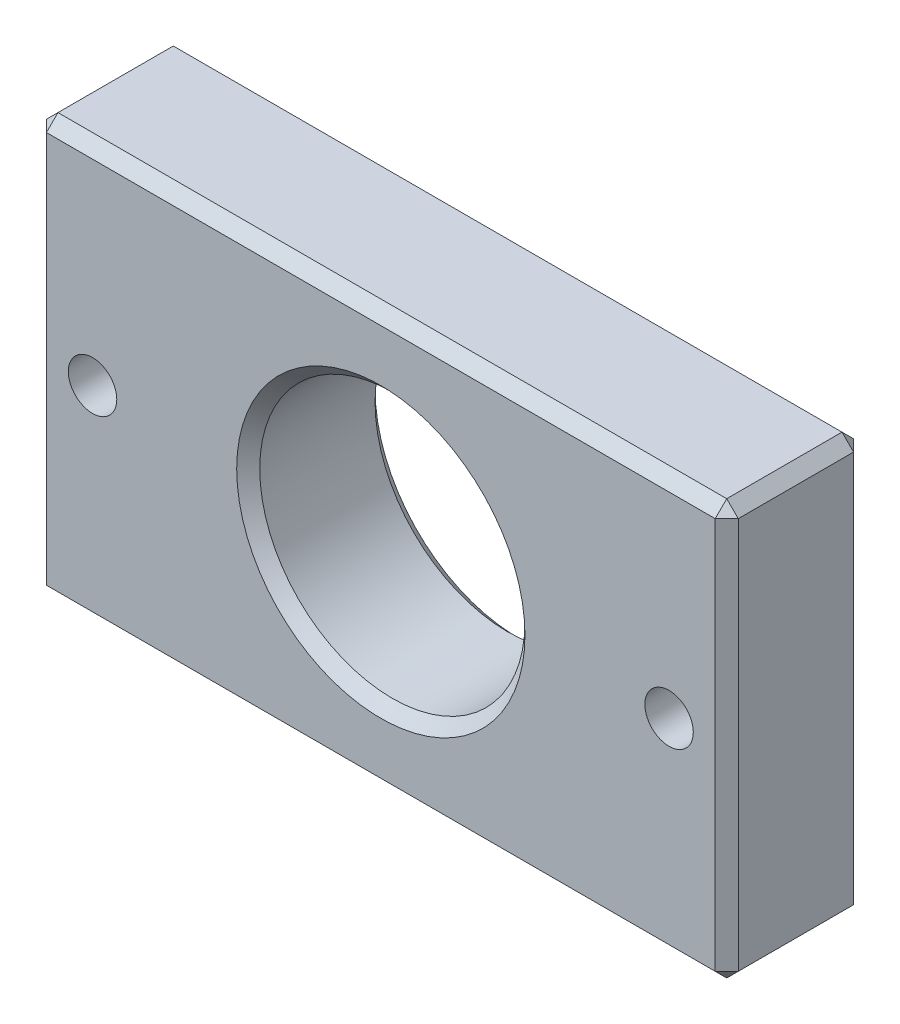
ISO-10303-21;
HEADER;
FILE_DESCRIPTION(('STEP AP214'),'2;1');
FILE_NAME('part.step','',(''),(''),'','','');
FILE_SCHEMA(('AUTOMOTIVE_DESIGN { 1 0 10303 214 1 1 1 1 }'));
ENDSEC;
DATA;
#1=APPLICATION_CONTEXT('core data for automotive mechanical design processes');
#2=APPLICATION_PROTOCOL_DEFINITION('international standard','automotive_design',2000,#1);
#3=PRODUCT_CONTEXT('',#1,'mechanical');
#4=PRODUCT('Part','Part','',(#3));
#5=PRODUCT_RELATED_PRODUCT_CATEGORY('part','',(#4));
#6=PRODUCT_DEFINITION_FORMATION('','',#4);
#7=PRODUCT_DEFINITION_CONTEXT('part definition',#1,'design');
#8=PRODUCT_DEFINITION('design','',#6,#7);
#9=PRODUCT_DEFINITION_SHAPE('','',#8);
#10=(LENGTH_UNIT() NAMED_UNIT(*) SI_UNIT(.MILLI.,.METRE.));
#11=(NAMED_UNIT(*) PLANE_ANGLE_UNIT() SI_UNIT($,.RADIAN.));
#12=(NAMED_UNIT(*) SI_UNIT($,.STERADIAN.) SOLID_ANGLE_UNIT());
#13=UNCERTAINTY_MEASURE_WITH_UNIT(LENGTH_MEASURE(1.E-05),#10,'distance_accuracy_value','');
#14=(GEOMETRIC_REPRESENTATION_CONTEXT(3) GLOBAL_UNCERTAINTY_ASSIGNED_CONTEXT((#13)) GLOBAL_UNIT_ASSIGNED_CONTEXT((#10,
#11,#12)) REPRESENTATION_CONTEXT('',''));
#15=CARTESIAN_POINT('',(0.,0.,0.));
#16=DIRECTION('',(0.,0.,1.));
#17=DIRECTION('',(1.,0.,0.));
#18=AXIS2_PLACEMENT_3D('',#15,#16,#17);
#19=CARTESIAN_POINT('',(-30.,18.,12.));
#20=DIRECTION('',(1.,0.,0.));
#21=DIRECTION('',(0.,1.,0.));
#22=AXIS2_PLACEMENT_3D('',#19,#20,#21);
#23=PLANE('',#22);
#24=DIRECTION('',(0.,-1.,0.));
#25=VECTOR('',#24,1.);
#26=CARTESIAN_POINT('',(-30.,18.,1.));
#27=LINE('',#26,#25);
#28=CARTESIAN_POINT('',(-30.,17.,1.));
#29=VERTEX_POINT('',#28);
#30=CARTESIAN_POINT('',(-30.,-17.,1.));
#31=VERTEX_POINT('',#30);
#32=EDGE_CURVE('E173',#29,#31,#27,.T.);
#33=ORIENTED_EDGE('',*,*,#32,.T.);
#34=DIRECTION('',(0.,0.,1.));
#35=VECTOR('',#34,1.);
#36=CARTESIAN_POINT('',(-30.,-17.,12.));
#37=LINE('',#36,#35);
#38=CARTESIAN_POINT('',(-30.,-17.,11.));
#39=VERTEX_POINT('',#38);
#40=EDGE_CURVE('E178',#31,#39,#37,.T.);
#41=ORIENTED_EDGE('',*,*,#40,.T.);
#42=DIRECTION('',(0.,1.,0.));
#43=VECTOR('',#42,1.);
#44=CARTESIAN_POINT('',(-30.,18.,11.));
#45=LINE('',#44,#43);
#46=CARTESIAN_POINT('',(-30.,17.,11.));
#47=VERTEX_POINT('',#46);
#48=EDGE_CURVE('E175',#39,#47,#45,.T.);
#49=ORIENTED_EDGE('',*,*,#48,.T.);
#50=DIRECTION('',(0.,0.,-1.));
#51=VECTOR('',#50,1.);
#52=CARTESIAN_POINT('',(-30.,17.,12.));
#53=LINE('',#52,#51);
#54=EDGE_CURVE('E171',#47,#29,#53,.T.);
#55=ORIENTED_EDGE('',*,*,#54,.T.);
#56=EDGE_LOOP('',(#33,#41,#49,#55));
#57=FACE_BOUND('',#56,.T.);
#58=ADVANCED_FACE('F35',(#57),#23,.F.);
#59=CARTESIAN_POINT('',(-30.,-18.,12.));
#60=DIRECTION('',(0.,1.,0.));
#61=DIRECTION('',(-1.,0.,0.));
#62=AXIS2_PLACEMENT_3D('',#59,#60,#61);
#63=PLANE('',#62);
#64=DIRECTION('',(-1.,0.,0.));
#65=VECTOR('',#64,1.);
#66=CARTESIAN_POINT('',(-30.,-18.,11.));
#67=LINE('',#66,#65);
#68=CARTESIAN_POINT('',(29.,-18.,11.));
#69=VERTEX_POINT('',#68);
#70=CARTESIAN_POINT('',(-29.,-18.,11.));
#71=VERTEX_POINT('',#70);
#72=EDGE_CURVE('E196',#69,#71,#67,.T.);
#73=ORIENTED_EDGE('',*,*,#72,.T.);
#74=DIRECTION('',(0.,0.,-1.));
#75=VECTOR('',#74,1.);
#76=CARTESIAN_POINT('',(-29.,-18.,12.));
#77=LINE('',#76,#75);
#78=CARTESIAN_POINT('',(-29.,-18.,1.));
#79=VERTEX_POINT('',#78);
#80=EDGE_CURVE('E198',#71,#79,#77,.T.);
#81=ORIENTED_EDGE('',*,*,#80,.T.);
#82=DIRECTION('',(1.,0.,0.));
#83=VECTOR('',#82,1.);
#84=CARTESIAN_POINT('',(-30.,-18.,1.));
#85=LINE('',#84,#83);
#86=CARTESIAN_POINT('',(29.,-18.,1.));
#87=VERTEX_POINT('',#86);
#88=EDGE_CURVE('E194',#79,#87,#85,.T.);
#89=ORIENTED_EDGE('',*,*,#88,.T.);
#90=DIRECTION('',(0.,0.,1.));
#91=VECTOR('',#90,1.);
#92=CARTESIAN_POINT('',(29.,-18.,12.));
#93=LINE('',#92,#91);
#94=EDGE_CURVE('E192',#87,#69,#93,.T.);
#95=ORIENTED_EDGE('',*,*,#94,.T.);
#96=EDGE_LOOP('',(#73,#81,#89,#95));
#97=FACE_BOUND('',#96,.T.);
#98=ADVANCED_FACE('F312',(#97),#63,.F.);
#99=CARTESIAN_POINT('',(30.,18.,12.));
#100=DIRECTION('',(-1.,0.,0.));
#101=DIRECTION('',(0.,-1.,0.));
#102=AXIS2_PLACEMENT_3D('',#99,#100,#101);
#103=PLANE('',#102);
#104=DIRECTION('',(0.,-1.,0.));
#105=VECTOR('',#104,1.);
#106=CARTESIAN_POINT('',(30.,-18.,11.));
#107=LINE('',#106,#105);
#108=CARTESIAN_POINT('',(30.,17.,11.));
#109=VERTEX_POINT('',#108);
#110=CARTESIAN_POINT('',(30.,-17.,11.));
#111=VERTEX_POINT('',#110);
#112=EDGE_CURVE('E143',#109,#111,#107,.T.);
#113=ORIENTED_EDGE('',*,*,#112,.T.);
#114=DIRECTION('',(0.,0.,-1.));
#115=VECTOR('',#114,1.);
#116=CARTESIAN_POINT('',(30.,-17.,12.));
#117=LINE('',#116,#115);
#118=CARTESIAN_POINT('',(30.,-17.,1.));
#119=VERTEX_POINT('',#118);
#120=EDGE_CURVE('E206',#111,#119,#117,.T.);
#121=ORIENTED_EDGE('',*,*,#120,.T.);
#122=DIRECTION('',(0.,1.,0.));
#123=VECTOR('',#122,1.);
#124=CARTESIAN_POINT('',(30.,18.,1.));
#125=LINE('',#124,#123);
#126=CARTESIAN_POINT('',(30.,17.,1.));
#127=VERTEX_POINT('',#126);
#128=EDGE_CURVE('E203',#119,#127,#125,.T.);
#129=ORIENTED_EDGE('',*,*,#128,.T.);
#130=DIRECTION('',(0.,0.,1.));
#131=VECTOR('',#130,1.);
#132=CARTESIAN_POINT('',(30.,17.,12.));
#133=LINE('',#132,#131);
#134=EDGE_CURVE('E201',#127,#109,#133,.T.);
#135=ORIENTED_EDGE('',*,*,#134,.T.);
#136=EDGE_LOOP('',(#113,#121,#129,#135));
#137=FACE_BOUND('',#136,.T.);
#138=ADVANCED_FACE('F308',(#137),#103,.F.);
#139=CARTESIAN_POINT('',(-30.,18.,12.));
#140=DIRECTION('',(0.,-1.,0.));
#141=DIRECTION('',(1.,0.,0.));
#142=AXIS2_PLACEMENT_3D('',#139,#140,#141);
#143=PLANE('',#142);
#144=DIRECTION('',(1.,0.,0.));
#145=VECTOR('',#144,1.);
#146=CARTESIAN_POINT('',(30.,18.,11.));
#147=LINE('',#146,#145);
#148=CARTESIAN_POINT('',(-29.,18.,11.));
#149=VERTEX_POINT('',#148);
#150=CARTESIAN_POINT('',(29.,18.,11.));
#151=VERTEX_POINT('',#150);
#152=EDGE_CURVE('E52',#149,#151,#147,.T.);
#153=ORIENTED_EDGE('',*,*,#152,.T.);
#154=DIRECTION('',(0.,0.,-1.));
#155=VECTOR('',#154,1.);
#156=CARTESIAN_POINT('',(29.,18.,12.));
#157=LINE('',#156,#155);
#158=CARTESIAN_POINT('',(29.,18.,1.));
#159=VERTEX_POINT('',#158);
#160=EDGE_CURVE('E213',#151,#159,#157,.T.);
#161=ORIENTED_EDGE('',*,*,#160,.T.);
#162=DIRECTION('',(-1.,0.,0.));
#163=VECTOR('',#162,1.);
#164=CARTESIAN_POINT('',(-30.,18.,1.));
#165=LINE('',#164,#163);
#166=CARTESIAN_POINT('',(-29.,18.,1.));
#167=VERTEX_POINT('',#166);
#168=EDGE_CURVE('E209',#159,#167,#165,.T.);
#169=ORIENTED_EDGE('',*,*,#168,.T.);
#170=DIRECTION('',(0.,0.,1.));
#171=VECTOR('',#170,1.);
#172=CARTESIAN_POINT('',(-29.,18.,12.));
#173=LINE('',#172,#171);
#174=EDGE_CURVE('E57',#167,#149,#173,.T.);
#175=ORIENTED_EDGE('',*,*,#174,.T.);
#176=EDGE_LOOP('',(#153,#161,#169,#175));
#177=FACE_BOUND('',#176,.T.);
#178=ADVANCED_FACE('F300',(#177),#143,.F.);
#179=CARTESIAN_POINT('',(0.,0.,12.));
#180=DIRECTION('',(0.,0.,1.));
#181=DIRECTION('',(1.,0.,0.));
#182=AXIS2_PLACEMENT_3D('',#179,#180,#181);
#183=PLANE('',#182);
#184=DIRECTION('',(-1.,0.,0.));
#185=VECTOR('',#184,1.);
#186=CARTESIAN_POINT('',(-30.,17.,12.));
#187=LINE('',#186,#185);
#188=CARTESIAN_POINT('',(29.,17.,12.));
#189=VERTEX_POINT('',#188);
#190=CARTESIAN_POINT('',(-29.,17.,12.));
#191=VERTEX_POINT('',#190);
#192=EDGE_CURVE('E130',#189,#191,#187,.T.);
#193=ORIENTED_EDGE('',*,*,#192,.T.);
#194=DIRECTION('',(0.,-1.,0.));
#195=VECTOR('',#194,1.);
#196=CARTESIAN_POINT('',(-29.,-18.,12.));
#197=LINE('',#196,#195);
#198=CARTESIAN_POINT('',(-29.,-17.,12.));
#199=VERTEX_POINT('',#198);
#200=EDGE_CURVE('E169',#191,#199,#197,.T.);
#201=ORIENTED_EDGE('',*,*,#200,.T.);
#202=DIRECTION('',(1.,0.,0.));
#203=VECTOR('',#202,1.);
#204=CARTESIAN_POINT('',(30.,-17.,12.));
#205=LINE('',#204,#203);
#206=CARTESIAN_POINT('',(29.,-17.,12.));
#207=VERTEX_POINT('',#206);
#208=EDGE_CURVE('E133',#199,#207,#205,.T.);
#209=ORIENTED_EDGE('',*,*,#208,.T.);
#210=DIRECTION('',(0.,1.,0.));
#211=VECTOR('',#210,1.);
#212=CARTESIAN_POINT('',(29.,18.,12.));
#213=LINE('',#212,#211);
#214=EDGE_CURVE('E124',#207,#189,#213,.T.);
#215=ORIENTED_EDGE('',*,*,#214,.T.);
#216=EDGE_LOOP('',(#193,#201,#209,#215));
#217=FACE_BOUND('',#216,.T.);
#218=CARTESIAN_POINT('',(0.,0.,12.));
#219=DIRECTION('',(0.,0.,1.));
#220=DIRECTION('',(1.,0.,0.));
#221=AXIS2_PLACEMENT_3D('',#218,#219,#220);
#222=CIRCLE('',#221,12.5);
#223=CARTESIAN_POINT('',(12.5,0.,12.));
#224=VERTEX_POINT('',#223);
#225=EDGE_CURVE('E161',#224,#224,#222,.F.);
#226=ORIENTED_EDGE('',*,*,#225,.T.);
#227=EDGE_LOOP('',(#226));
#228=FACE_BOUND('',#227,.T.);
#229=CARTESIAN_POINT('',(-25.,0.,12.));
#230=DIRECTION('',(0.,0.,1.));
#231=DIRECTION('',(1.,0.,0.));
#232=AXIS2_PLACEMENT_3D('',#229,#230,#231);
#233=CIRCLE('',#232,2.09999999999999);
#234=CARTESIAN_POINT('',(-22.9,0.,12.));
#235=VERTEX_POINT('',#234);
#236=EDGE_CURVE('E271',#235,#235,#233,.T.);
#237=ORIENTED_EDGE('',*,*,#236,.F.);
#238=EDGE_LOOP('',(#237));
#239=FACE_BOUND('',#238,.T.);
#240=CARTESIAN_POINT('',(25.,0.,12.));
#241=DIRECTION('',(0.,0.,1.));
#242=DIRECTION('',(1.,0.,0.));
#243=AXIS2_PLACEMENT_3D('',#240,#241,#242);
#244=CIRCLE('',#243,2.09999999999999);
#245=CARTESIAN_POINT('',(27.1,0.,12.));
#246=VERTEX_POINT('',#245);
#247=EDGE_CURVE('E282',#246,#246,#244,.T.);
#248=ORIENTED_EDGE('',*,*,#247,.F.);
#249=EDGE_LOOP('',(#248));
#250=FACE_BOUND('',#249,.T.);
#251=ADVANCED_FACE('F126',(#217,#228,#239,#250),#183,.T.);
#252=CARTESIAN_POINT('',(0.,0.,0.));
#253=DIRECTION('',(0.,0.,1.));
#254=DIRECTION('',(1.,0.,0.));
#255=AXIS2_PLACEMENT_3D('',#252,#253,#254);
#256=PLANE('',#255);
#257=DIRECTION('',(-1.,0.,0.));
#258=VECTOR('',#257,1.);
#259=CARTESIAN_POINT('',(0.,-17.,0.));
#260=LINE('',#259,#258);
#261=CARTESIAN_POINT('',(29.,-17.,0.));
#262=VERTEX_POINT('',#261);
#263=CARTESIAN_POINT('',(-29.,-17.,0.));
#264=VERTEX_POINT('',#263);
#265=EDGE_CURVE('E187',#262,#264,#260,.T.);
#266=ORIENTED_EDGE('',*,*,#265,.T.);
#267=DIRECTION('',(0.,1.,0.));
#268=VECTOR('',#267,1.);
#269=CARTESIAN_POINT('',(-29.,0.,0.));
#270=LINE('',#269,#268);
#271=CARTESIAN_POINT('',(-29.,17.,0.));
#272=VERTEX_POINT('',#271);
#273=EDGE_CURVE('E189',#264,#272,#270,.T.);
#274=ORIENTED_EDGE('',*,*,#273,.T.);
#275=DIRECTION('',(1.,0.,0.));
#276=VECTOR('',#275,1.);
#277=CARTESIAN_POINT('',(0.,17.,0.));
#278=LINE('',#277,#276);
#279=CARTESIAN_POINT('',(29.,17.,0.));
#280=VERTEX_POINT('',#279);
#281=EDGE_CURVE('E183',#272,#280,#278,.T.);
#282=ORIENTED_EDGE('',*,*,#281,.T.);
#283=DIRECTION('',(0.,-1.,0.));
#284=VECTOR('',#283,1.);
#285=CARTESIAN_POINT('',(29.,0.,0.));
#286=LINE('',#285,#284);
#287=EDGE_CURVE('E185',#280,#262,#286,.T.);
#288=ORIENTED_EDGE('',*,*,#287,.T.);
#289=EDGE_LOOP('',(#266,#274,#282,#288));
#290=FACE_BOUND('',#289,.T.);
#291=CARTESIAN_POINT('',(0.,0.,0.));
#292=DIRECTION('',(0.,0.,1.));
#293=DIRECTION('',(1.,0.,0.));
#294=AXIS2_PLACEMENT_3D('',#291,#292,#293);
#295=CIRCLE('',#294,12.5);
#296=CARTESIAN_POINT('',(12.5,0.,0.));
#297=VERTEX_POINT('',#296);
#298=EDGE_CURVE('E180',#297,#297,#295,.T.);
#299=ORIENTED_EDGE('',*,*,#298,.T.);
#300=EDGE_LOOP('',(#299));
#301=FACE_BOUND('',#300,.T.);
#302=CARTESIAN_POINT('',(-25.,0.,0.));
#303=DIRECTION('',(0.,0.,1.));
#304=DIRECTION('',(1.,0.,0.));
#305=AXIS2_PLACEMENT_3D('',#302,#303,#304);
#306=CIRCLE('',#305,2.09999999999999);
#307=CARTESIAN_POINT('',(-22.9,0.,0.));
#308=VERTEX_POINT('',#307);
#309=EDGE_CURVE('E277',#308,#308,#306,.T.);
#310=ORIENTED_EDGE('',*,*,#309,.T.);
#311=EDGE_LOOP('',(#310));
#312=FACE_BOUND('',#311,.T.);
#313=CARTESIAN_POINT('',(25.,0.,0.));
#314=DIRECTION('',(0.,0.,1.));
#315=DIRECTION('',(1.,0.,0.));
#316=AXIS2_PLACEMENT_3D('',#313,#314,#315);
#317=CIRCLE('',#316,2.09999999999999);
#318=CARTESIAN_POINT('',(27.1,0.,0.));
#319=VERTEX_POINT('',#318);
#320=EDGE_CURVE('E164',#319,#319,#317,.T.);
#321=ORIENTED_EDGE('',*,*,#320,.T.);
#322=EDGE_LOOP('',(#321));
#323=FACE_BOUND('',#322,.T.);
#324=ADVANCED_FACE('F289',(#290,#301,#312,#323),#256,.F.);
#325=CARTESIAN_POINT('',(0.,0.,-0.000999999999999265));
#326=DIRECTION('',(0.,0.,1.));
#327=DIRECTION('',(1.,0.,0.));
#328=AXIS2_PLACEMENT_3D('',#325,#326,#327);
#329=CYLINDRICAL_SURFACE('',#328,11.5);
#330=CARTESIAN_POINT('',(0.,0.,0.999999999999987));
#331=DIRECTION('',(0.,0.,1.));
#332=DIRECTION('',(1.,0.,0.));
#333=AXIS2_PLACEMENT_3D('',#330,#331,#332);
#334=CIRCLE('',#333,11.5);
#335=CARTESIAN_POINT('',(11.5,0.,0.999999999999987));
#336=VERTEX_POINT('',#335);
#337=EDGE_CURVE('E11',#336,#336,#334,.F.);
#338=ORIENTED_EDGE('',*,*,#337,.T.);
#339=EDGE_LOOP('',(#338));
#340=FACE_BOUND('',#339,.T.);
#341=CARTESIAN_POINT('',(0.,0.,11.));
#342=DIRECTION('',(0.,0.,1.));
#343=DIRECTION('',(1.,0.,0.));
#344=AXIS2_PLACEMENT_3D('',#341,#342,#343);
#345=CIRCLE('',#344,11.5);
#346=CARTESIAN_POINT('',(11.5,0.,11.));
#347=VERTEX_POINT('',#346);
#348=EDGE_CURVE('E44',#347,#347,#345,.T.);
#349=ORIENTED_EDGE('',*,*,#348,.T.);
#350=EDGE_LOOP('',(#349));
#351=FACE_BOUND('',#350,.T.);
#352=ADVANCED_FACE('F295',(#340,#351),#329,.F.);
#353=CARTESIAN_POINT('',(25.,0.,12.));
#354=DIRECTION('',(0.,0.,1.));
#355=DIRECTION('',(1.,0.,0.));
#356=AXIS2_PLACEMENT_3D('',#353,#354,#355);
#357=CYLINDRICAL_SURFACE('',#356,2.09999999999999);
#358=ORIENTED_EDGE('',*,*,#320,.F.);
#359=EDGE_LOOP('',(#358));
#360=FACE_BOUND('',#359,.T.);
#361=ORIENTED_EDGE('',*,*,#247,.T.);
#362=EDGE_LOOP('',(#361));
#363=FACE_BOUND('',#362,.T.);
#364=ADVANCED_FACE('F291',(#360,#363),#357,.F.);
#365=CARTESIAN_POINT('',(-25.,0.,12.));
#366=DIRECTION('',(0.,0.,1.));
#367=DIRECTION('',(1.,0.,0.));
#368=AXIS2_PLACEMENT_3D('',#365,#366,#367);
#369=CYLINDRICAL_SURFACE('',#368,2.09999999999999);
#370=ORIENTED_EDGE('',*,*,#309,.F.);
#371=EDGE_LOOP('',(#370));
#372=FACE_BOUND('',#371,.T.);
#373=ORIENTED_EDGE('',*,*,#236,.T.);
#374=EDGE_LOOP('',(#373));
#375=FACE_BOUND('',#374,.T.);
#376=ADVANCED_FACE('F294',(#372,#375),#369,.F.);
#377=CARTESIAN_POINT('',(30.,18.,1.));
#378=DIRECTION('',(-0.707106781186546,0.,0.707106781186549));
#379=DIRECTION('',(0.,1.,0.));
#380=AXIS2_PLACEMENT_3D('',#377,#378,#379);
#381=PLANE('',#380);
#382=DIRECTION('',(0.707106781186549,0.,0.707106781186546));
#383=VECTOR('',#382,1.);
#384=CARTESIAN_POINT('',(30.,17.,1.));
#385=LINE('',#384,#383);
#386=EDGE_CURVE('E39',#127,#280,#385,.F.);
#387=ORIENTED_EDGE('',*,*,#386,.F.);
#388=ORIENTED_EDGE('',*,*,#128,.F.);
#389=DIRECTION('',(-0.707106781186549,0.,-0.707106781186546));
#390=VECTOR('',#389,1.);
#391=CARTESIAN_POINT('',(29.5,-17.,0.499999999999995));
#392=LINE('',#391,#390);
#393=EDGE_CURVE('E263',#262,#119,#392,.F.);
#394=ORIENTED_EDGE('',*,*,#393,.F.);
#395=ORIENTED_EDGE('',*,*,#287,.F.);
#396=EDGE_LOOP('',(#387,#388,#394,#395));
#397=FACE_BOUND('',#396,.T.);
#398=ADVANCED_FACE('F391',(#397),#381,.F.);
#399=CARTESIAN_POINT('',(30.,17.,1.));
#400=DIRECTION('',(0.577350269189627,0.577350269189623,-0.577350269189627));
#401=DIRECTION('',(-0.707106781186548,0.,-0.707106781186547));
#402=AXIS2_PLACEMENT_3D('',#399,#400,#401);
#403=PLANE('',#402);
#404=DIRECTION('',(-0.707106781186545,0.70710678118655,0.));
#405=VECTOR('',#404,1.);
#406=CARTESIAN_POINT('',(30.,17.,1.));
#407=LINE('',#406,#405);
#408=EDGE_CURVE('E258',#127,#159,#407,.T.);
#409=ORIENTED_EDGE('',*,*,#408,.F.);
#410=ORIENTED_EDGE('',*,*,#386,.T.);
#411=DIRECTION('',(0.,-0.707106781186549,-0.707106781186546));
#412=VECTOR('',#411,1.);
#413=CARTESIAN_POINT('',(29.,17.5,0.499999999999998));
#414=LINE('',#413,#412);
#415=EDGE_CURVE('E261',#159,#280,#414,.T.);
#416=ORIENTED_EDGE('',*,*,#415,.F.);
#417=EDGE_LOOP('',(#409,#410,#416));
#418=FACE_BOUND('',#417,.T.);
#419=ADVANCED_FACE('F388',(#418),#403,.T.);
#420=CARTESIAN_POINT('',(29.,-18.,1.));
#421=DIRECTION('',(0.577350269189624,-0.577350269189626,-0.577350269189626));
#422=DIRECTION('',(0.,0.707106781186547,-0.707106781186547));
#423=AXIS2_PLACEMENT_3D('',#420,#421,#422);
#424=PLANE('',#423);
#425=DIRECTION('',(0.,-0.707106781186551,0.707106781186544));
#426=VECTOR('',#425,1.);
#427=CARTESIAN_POINT('',(29.,-18.,1.));
#428=LINE('',#427,#426);
#429=EDGE_CURVE('E253',#262,#87,#428,.T.);
#430=ORIENTED_EDGE('',*,*,#429,.F.);
#431=ORIENTED_EDGE('',*,*,#393,.T.);
#432=DIRECTION('',(0.707106781186549,0.707106781186546,0.));
#433=VECTOR('',#432,1.);
#434=CARTESIAN_POINT('',(29.,-18.,1.));
#435=LINE('',#434,#433);
#436=EDGE_CURVE('E256',#87,#119,#435,.T.);
#437=ORIENTED_EDGE('',*,*,#436,.F.);
#438=EDGE_LOOP('',(#430,#431,#437));
#439=FACE_BOUND('',#438,.T.);
#440=ADVANCED_FACE('F384',(#439),#424,.T.);
#441=CARTESIAN_POINT('',(-30.,18.,1.));
#442=DIRECTION('',(0.,-0.707106781186546,0.707106781186549));
#443=DIRECTION('',(-1.,0.,0.));
#444=AXIS2_PLACEMENT_3D('',#441,#442,#443);
#445=PLANE('',#444);
#446=ORIENTED_EDGE('',*,*,#415,.T.);
#447=ORIENTED_EDGE('',*,*,#281,.F.);
#448=DIRECTION('',(0.,0.707106781186549,0.707106781186546));
#449=VECTOR('',#448,1.);
#450=CARTESIAN_POINT('',(-29.,17.,0.));
#451=LINE('',#450,#449);
#452=EDGE_CURVE('E248',#167,#272,#451,.F.);
#453=ORIENTED_EDGE('',*,*,#452,.F.);
#454=ORIENTED_EDGE('',*,*,#168,.F.);
#455=EDGE_LOOP('',(#446,#447,#453,#454));
#456=FACE_BOUND('',#455,.T.);
#457=ADVANCED_FACE('F380',(#456),#445,.F.);
#458=CARTESIAN_POINT('',(29.,18.,12.));
#459=DIRECTION('',(-0.70710678118655,-0.707106781186545,0.));
#460=DIRECTION('',(0.,0.,-1.));
#461=AXIS2_PLACEMENT_3D('',#458,#459,#460);
#462=PLANE('',#461);
#463=ORIENTED_EDGE('',*,*,#408,.T.);
#464=ORIENTED_EDGE('',*,*,#160,.F.);
#465=DIRECTION('',(0.707106781186545,-0.70710678118655,0.));
#466=VECTOR('',#465,1.);
#467=CARTESIAN_POINT('',(29.5,17.5,11.));
#468=LINE('',#467,#466);
#469=EDGE_CURVE('E147',#109,#151,#468,.F.);
#470=ORIENTED_EDGE('',*,*,#469,.F.);
#471=ORIENTED_EDGE('',*,*,#134,.F.);
#472=EDGE_LOOP('',(#463,#464,#470,#471));
#473=FACE_BOUND('',#472,.T.);
#474=ADVANCED_FACE('F377',(#473),#462,.F.);
#475=CARTESIAN_POINT('',(29.,0.,12.));
#476=DIRECTION('',(0.707106781186551,0.,0.707106781186544));
#477=DIRECTION('',(0.,-1.,0.));
#478=AXIS2_PLACEMENT_3D('',#475,#476,#477);
#479=PLANE('',#478);
#480=DIRECTION('',(-0.707106781186544,0.,0.707106781186551));
#481=VECTOR('',#480,1.);
#482=CARTESIAN_POINT('',(29.,-17.,12.));
#483=LINE('',#482,#481);
#484=EDGE_CURVE('E148',#111,#207,#483,.T.);
#485=ORIENTED_EDGE('',*,*,#484,.F.);
#486=ORIENTED_EDGE('',*,*,#112,.F.);
#487=DIRECTION('',(0.707106781186544,0.,-0.70710678118655));
#488=VECTOR('',#487,1.);
#489=CARTESIAN_POINT('',(29.,17.,12.));
#490=LINE('',#489,#488);
#491=EDGE_CURVE('E140',#189,#109,#490,.T.);
#492=ORIENTED_EDGE('',*,*,#491,.F.);
#493=ORIENTED_EDGE('',*,*,#214,.F.);
#494=EDGE_LOOP('',(#485,#486,#492,#493));
#495=FACE_BOUND('',#494,.T.);
#496=ADVANCED_FACE('F142',(#495),#479,.T.);
#497=CARTESIAN_POINT('',(30.,-17.,12.));
#498=DIRECTION('',(-0.707106781186546,0.707106781186549,0.));
#499=DIRECTION('',(0.,0.,-1.));
#500=AXIS2_PLACEMENT_3D('',#497,#498,#499);
#501=PLANE('',#500);
#502=ORIENTED_EDGE('',*,*,#436,.T.);
#503=ORIENTED_EDGE('',*,*,#120,.F.);
#504=DIRECTION('',(-0.707106781186549,-0.707106781186546,0.));
#505=VECTOR('',#504,1.);
#506=CARTESIAN_POINT('',(29.5,-17.5,11.));
#507=LINE('',#506,#505);
#508=EDGE_CURVE('E243',#69,#111,#507,.F.);
#509=ORIENTED_EDGE('',*,*,#508,.F.);
#510=ORIENTED_EDGE('',*,*,#94,.F.);
#511=EDGE_LOOP('',(#502,#503,#509,#510));
#512=FACE_BOUND('',#511,.T.);
#513=ADVANCED_FACE('F370',(#512),#501,.F.);
#514=CARTESIAN_POINT('',(-30.,-18.,1.));
#515=DIRECTION('',(0.,0.707106781186544,0.707106781186551));
#516=DIRECTION('',(1.,0.,0.));
#517=AXIS2_PLACEMENT_3D('',#514,#515,#516);
#518=PLANE('',#517);
#519=ORIENTED_EDGE('',*,*,#429,.T.);
#520=ORIENTED_EDGE('',*,*,#88,.F.);
#521=DIRECTION('',(0.,0.707106781186551,-0.707106781186544));
#522=VECTOR('',#521,1.);
#523=CARTESIAN_POINT('',(-29.,-17.5,0.499999999999999));
#524=LINE('',#523,#522);
#525=EDGE_CURVE('E240',#264,#79,#524,.F.);
#526=ORIENTED_EDGE('',*,*,#525,.F.);
#527=ORIENTED_EDGE('',*,*,#265,.F.);
#528=EDGE_LOOP('',(#519,#520,#526,#527));
#529=FACE_BOUND('',#528,.T.);
#530=ADVANCED_FACE('F366',(#529),#518,.F.);
#531=CARTESIAN_POINT('',(-30.,18.,1.));
#532=DIRECTION('',(0.707106781186545,0.,0.70710678118655));
#533=DIRECTION('',(0.,-1.,0.));
#534=AXIS2_PLACEMENT_3D('',#531,#532,#533);
#535=PLANE('',#534);
#536=DIRECTION('',(0.70710678118655,0.,-0.707106781186545));
#537=VECTOR('',#536,1.);
#538=CARTESIAN_POINT('',(-29.,17.,0.));
#539=LINE('',#538,#537);
#540=EDGE_CURVE('E250',#272,#29,#539,.F.);
#541=ORIENTED_EDGE('',*,*,#540,.F.);
#542=ORIENTED_EDGE('',*,*,#273,.F.);
#543=DIRECTION('',(-0.70710678118655,0.,0.707106781186545));
#544=VECTOR('',#543,1.);
#545=CARTESIAN_POINT('',(-30.,-17.,1.));
#546=LINE('',#545,#544);
#547=EDGE_CURVE('E237',#31,#264,#546,.F.);
#548=ORIENTED_EDGE('',*,*,#547,.F.);
#549=ORIENTED_EDGE('',*,*,#32,.F.);
#550=EDGE_LOOP('',(#541,#542,#548,#549));
#551=FACE_BOUND('',#550,.T.);
#552=ADVANCED_FACE('F362',(#551),#535,.F.);
#553=CARTESIAN_POINT('',(-29.,17.,0.));
#554=DIRECTION('',(-0.577350269189626,0.577350269189622,-0.577350269189628));
#555=DIRECTION('',(-0.707106781186549,0.,0.707106781186546));
#556=AXIS2_PLACEMENT_3D('',#553,#554,#555);
#557=PLANE('',#556);
#558=ORIENTED_EDGE('',*,*,#452,.T.);
#559=ORIENTED_EDGE('',*,*,#540,.T.);
#560=DIRECTION('',(-0.707106781186545,-0.70710678118655,0.));
#561=VECTOR('',#560,1.);
#562=CARTESIAN_POINT('',(-29.5,17.5,1.));
#563=LINE('',#562,#561);
#564=EDGE_CURVE('E154',#167,#29,#563,.T.);
#565=ORIENTED_EDGE('',*,*,#564,.F.);
#566=EDGE_LOOP('',(#558,#559,#565));
#567=FACE_BOUND('',#566,.T.);
#568=ADVANCED_FACE('F359',(#567),#557,.T.);
#569=CARTESIAN_POINT('',(29.,17.,12.));
#570=DIRECTION('',(0.577350269189631,0.577350269189622,0.577350269189625));
#571=DIRECTION('',(0.707106781186544,0.,-0.707106781186551));
#572=AXIS2_PLACEMENT_3D('',#569,#570,#571);
#573=PLANE('',#572);
#574=ORIENTED_EDGE('',*,*,#491,.T.);
#575=ORIENTED_EDGE('',*,*,#469,.T.);
#576=DIRECTION('',(0.,-0.707106781186549,0.707106781186546));
#577=VECTOR('',#576,1.);
#578=CARTESIAN_POINT('',(29.,17.,12.));
#579=LINE('',#578,#577);
#580=EDGE_CURVE('E151',#189,#151,#579,.F.);
#581=ORIENTED_EDGE('',*,*,#580,.F.);
#582=EDGE_LOOP('',(#574,#575,#581));
#583=FACE_BOUND('',#582,.T.);
#584=ADVANCED_FACE('F152',(#583),#573,.T.);
#585=CARTESIAN_POINT('',(29.,-17.,12.));
#586=DIRECTION('',(0.577350269189628,-0.57735026918963,0.577350269189618));
#587=DIRECTION('',(0.707106781186549,0.707106781186546,0.));
#588=AXIS2_PLACEMENT_3D('',#585,#586,#587);
#589=PLANE('',#588);
#590=ORIENTED_EDGE('',*,*,#508,.T.);
#591=ORIENTED_EDGE('',*,*,#484,.T.);
#592=DIRECTION('',(0.,-0.707106781186546,-0.707106781186549));
#593=VECTOR('',#592,1.);
#594=CARTESIAN_POINT('',(29.,-17.,12.));
#595=LINE('',#594,#593);
#596=EDGE_CURVE('E155',#69,#207,#595,.F.);
#597=ORIENTED_EDGE('',*,*,#596,.F.);
#598=EDGE_LOOP('',(#590,#591,#597));
#599=FACE_BOUND('',#598,.T.);
#600=ADVANCED_FACE('F352',(#599),#589,.T.);
#601=CARTESIAN_POINT('',(-30.,-17.,1.));
#602=DIRECTION('',(-0.577350269189626,-0.577350269189622,-0.57735026918963));
#603=DIRECTION('',(-0.70710678118655,0.,0.707106781186545));
#604=AXIS2_PLACEMENT_3D('',#601,#602,#603);
#605=PLANE('',#604);
#606=ORIENTED_EDGE('',*,*,#547,.T.);
#607=ORIENTED_EDGE('',*,*,#525,.T.);
#608=DIRECTION('',(0.707106781186545,-0.70710678118655,0.));
#609=VECTOR('',#608,1.);
#610=CARTESIAN_POINT('',(-30.,-17.,1.));
#611=LINE('',#610,#609);
#612=EDGE_CURVE('E231',#31,#79,#611,.T.);
#613=ORIENTED_EDGE('',*,*,#612,.F.);
#614=EDGE_LOOP('',(#606,#607,#613));
#615=FACE_BOUND('',#614,.T.);
#616=ADVANCED_FACE('F348',(#615),#605,.T.);
#617=CARTESIAN_POINT('',(-30.,17.,12.));
#618=DIRECTION('',(0.70710678118655,-0.707106781186545,0.));
#619=DIRECTION('',(0.,0.,-1.));
#620=AXIS2_PLACEMENT_3D('',#617,#618,#619);
#621=PLANE('',#620);
#622=ORIENTED_EDGE('',*,*,#564,.T.);
#623=ORIENTED_EDGE('',*,*,#54,.F.);
#624=DIRECTION('',(0.707106781186545,0.70710678118655,0.));
#625=VECTOR('',#624,1.);
#626=CARTESIAN_POINT('',(-30.,17.,11.));
#627=LINE('',#626,#625);
#628=EDGE_CURVE('E228',#149,#47,#627,.F.);
#629=ORIENTED_EDGE('',*,*,#628,.F.);
#630=ORIENTED_EDGE('',*,*,#174,.F.);
#631=EDGE_LOOP('',(#622,#623,#629,#630));
#632=FACE_BOUND('',#631,.T.);
#633=ADVANCED_FACE('F345',(#632),#621,.F.);
#634=CARTESIAN_POINT('',(0.,17.,12.));
#635=DIRECTION('',(0.,0.707106781186546,0.707106781186549));
#636=DIRECTION('',(1.,0.,0.));
#637=AXIS2_PLACEMENT_3D('',#634,#635,#636);
#638=PLANE('',#637);
#639=ORIENTED_EDGE('',*,*,#580,.T.);
#640=ORIENTED_EDGE('',*,*,#152,.F.);
#641=DIRECTION('',(0.,0.707106781186549,-0.707106781186546));
#642=VECTOR('',#641,1.);
#643=CARTESIAN_POINT('',(-29.,17.5,11.5));
#644=LINE('',#643,#642);
#645=EDGE_CURVE('E159',#191,#149,#644,.T.);
#646=ORIENTED_EDGE('',*,*,#645,.F.);
#647=ORIENTED_EDGE('',*,*,#192,.F.);
#648=EDGE_LOOP('',(#639,#640,#646,#647));
#649=FACE_BOUND('',#648,.T.);
#650=ADVANCED_FACE('F157',(#649),#638,.T.);
#651=CARTESIAN_POINT('',(0.,-17.,12.));
#652=DIRECTION('',(0.,-0.707106781186549,0.707106781186546));
#653=DIRECTION('',(-1.,0.,0.));
#654=AXIS2_PLACEMENT_3D('',#651,#652,#653);
#655=PLANE('',#654);
#656=ORIENTED_EDGE('',*,*,#596,.T.);
#657=ORIENTED_EDGE('',*,*,#208,.F.);
#658=DIRECTION('',(0.,0.707106781186546,0.707106781186549));
#659=VECTOR('',#658,1.);
#660=CARTESIAN_POINT('',(-29.,-17.,12.));
#661=LINE('',#660,#659);
#662=EDGE_CURVE('E224',#71,#199,#661,.T.);
#663=ORIENTED_EDGE('',*,*,#662,.F.);
#664=ORIENTED_EDGE('',*,*,#72,.F.);
#665=EDGE_LOOP('',(#656,#657,#663,#664));
#666=FACE_BOUND('',#665,.T.);
#667=ADVANCED_FACE('F338',(#666),#655,.T.);
#668=CARTESIAN_POINT('',(-29.,-18.,12.));
#669=DIRECTION('',(0.70710678118655,0.707106781186545,0.));
#670=DIRECTION('',(0.,0.,-1.));
#671=AXIS2_PLACEMENT_3D('',#668,#669,#670);
#672=PLANE('',#671);
#673=ORIENTED_EDGE('',*,*,#612,.T.);
#674=ORIENTED_EDGE('',*,*,#80,.F.);
#675=DIRECTION('',(-0.707106781186545,0.70710678118655,0.));
#676=VECTOR('',#675,1.);
#677=CARTESIAN_POINT('',(-29.5,-17.5,11.));
#678=LINE('',#677,#676);
#679=EDGE_CURVE('E221',#39,#71,#678,.F.);
#680=ORIENTED_EDGE('',*,*,#679,.F.);
#681=ORIENTED_EDGE('',*,*,#40,.F.);
#682=EDGE_LOOP('',(#673,#674,#680,#681));
#683=FACE_BOUND('',#682,.T.);
#684=ADVANCED_FACE('F334',(#683),#672,.F.);
#685=CARTESIAN_POINT('',(-30.,17.,11.));
#686=DIRECTION('',(-0.57735026918963,0.577350269189622,0.577350269189626));
#687=DIRECTION('',(0.707106781186545,0.,0.70710678118655));
#688=AXIS2_PLACEMENT_3D('',#685,#686,#687);
#689=PLANE('',#688);
#690=ORIENTED_EDGE('',*,*,#645,.T.);
#691=ORIENTED_EDGE('',*,*,#628,.T.);
#692=DIRECTION('',(0.707106781186545,0.,0.70710678118655));
#693=VECTOR('',#692,1.);
#694=CARTESIAN_POINT('',(-30.,17.,11.));
#695=LINE('',#694,#693);
#696=EDGE_CURVE('E219',#191,#47,#695,.F.);
#697=ORIENTED_EDGE('',*,*,#696,.F.);
#698=EDGE_LOOP('',(#690,#691,#697));
#699=FACE_BOUND('',#698,.T.);
#700=ADVANCED_FACE('F330',(#699),#689,.T.);
#701=CARTESIAN_POINT('',(-29.,-17.,12.));
#702=DIRECTION('',(-0.57735026918963,-0.577350269189626,0.577350269189622));
#703=DIRECTION('',(0.707106781186545,-0.70710678118655,0.));
#704=AXIS2_PLACEMENT_3D('',#701,#702,#703);
#705=PLANE('',#704);
#706=ORIENTED_EDGE('',*,*,#679,.T.);
#707=ORIENTED_EDGE('',*,*,#662,.T.);
#708=DIRECTION('',(-0.707106781186545,0.,-0.70710678118655));
#709=VECTOR('',#708,1.);
#710=CARTESIAN_POINT('',(-29.,-17.,12.));
#711=LINE('',#710,#709);
#712=EDGE_CURVE('E217',#39,#199,#711,.F.);
#713=ORIENTED_EDGE('',*,*,#712,.F.);
#714=EDGE_LOOP('',(#706,#707,#713));
#715=FACE_BOUND('',#714,.T.);
#716=ADVANCED_FACE('F326',(#715),#705,.T.);
#717=CARTESIAN_POINT('',(-29.,0.,12.));
#718=DIRECTION('',(-0.70710678118655,0.,0.707106781186545));
#719=DIRECTION('',(0.,1.,0.));
#720=AXIS2_PLACEMENT_3D('',#717,#718,#719);
#721=PLANE('',#720);
#722=ORIENTED_EDGE('',*,*,#696,.T.);
#723=ORIENTED_EDGE('',*,*,#48,.F.);
#724=ORIENTED_EDGE('',*,*,#712,.T.);
#725=ORIENTED_EDGE('',*,*,#200,.F.);
#726=EDGE_LOOP('',(#722,#723,#724,#725));
#727=FACE_BOUND('',#726,.T.);
#728=ADVANCED_FACE('F322',(#727),#721,.T.);
#729=CARTESIAN_POINT('',(0.,0.,0.999999999999987));
#730=DIRECTION('',(0.,0.,-1.));
#731=DIRECTION('',(-1.,0.,0.));
#732=AXIS2_PLACEMENT_3D('',#729,#730,#731);
#733=CONICAL_SURFACE('',#732,11.5,0.78539816339745);
#734=ORIENTED_EDGE('',*,*,#298,.F.);
#735=EDGE_LOOP('',(#734));
#736=FACE_BOUND('',#735,.T.);
#737=ORIENTED_EDGE('',*,*,#337,.F.);
#738=EDGE_LOOP('',(#737));
#739=FACE_BOUND('',#738,.T.);
#740=ADVANCED_FACE('F325',(#736,#739),#733,.F.);
#741=CARTESIAN_POINT('',(0.,0.,11.));
#742=DIRECTION('',(0.,0.,1.));
#743=DIRECTION('',(1.,0.,0.));
#744=AXIS2_PLACEMENT_3D('',#741,#742,#743);
#745=CONICAL_SURFACE('',#744,11.5,0.78539816339745);
#746=ORIENTED_EDGE('',*,*,#225,.F.);
#747=EDGE_LOOP('',(#746));
#748=FACE_BOUND('',#747,.T.);
#749=ORIENTED_EDGE('',*,*,#348,.F.);
#750=EDGE_LOOP('',(#749));
#751=FACE_BOUND('',#750,.T.);
#752=ADVANCED_FACE('F37',(#748,#751),#745,.F.);
#753=CLOSED_SHELL('',(#58,#98,#138,#178,#251,#324,#352,#364,#376,#398,#419,#440,#457,#474,#496,
#513,#530,#552,#568,#584,#600,#616,#633,#650,#667,#684,#700,#716,#728,#740,#752));
#754=MANIFOLD_SOLID_BREP('B2',#753);
#755=ADVANCED_BREP_SHAPE_REPRESENTATION('',(#18,#754),#14);
#756=SHAPE_DEFINITION_REPRESENTATION(#9,#755);
ENDSEC;
END-ISO-10303-21;
